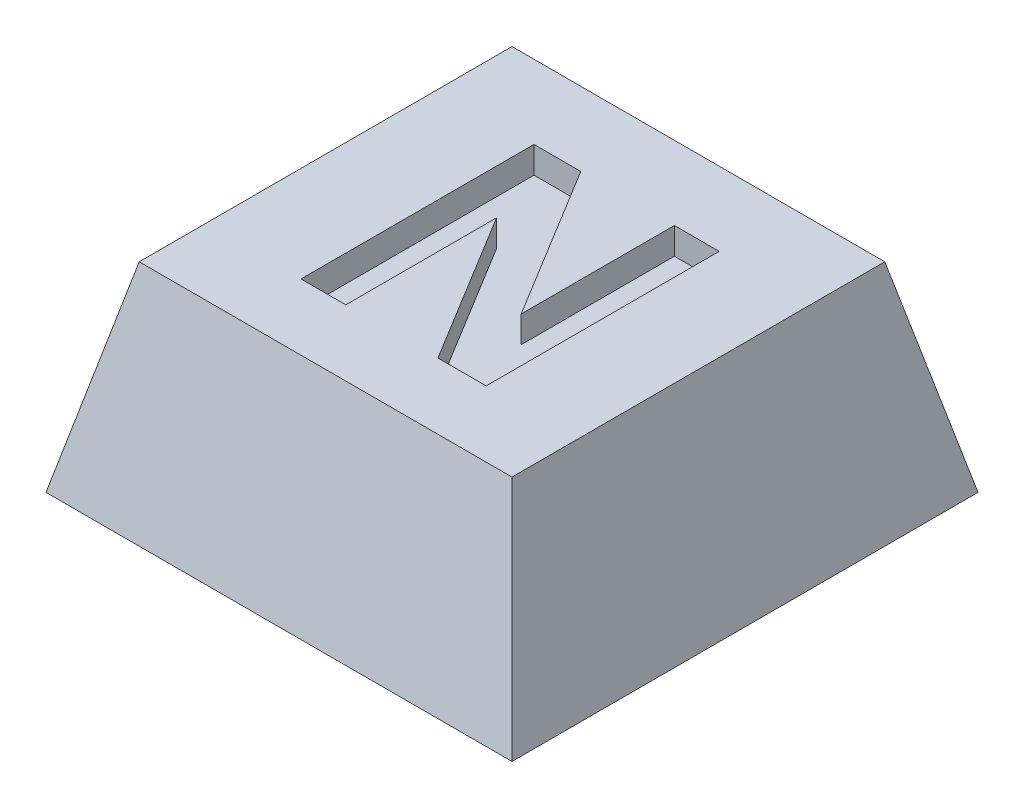
ISO-10303-21;
HEADER;
FILE_DESCRIPTION(('STEP AP214'),'2;1');
FILE_NAME('part.step','',(''),(''),'','','');
FILE_SCHEMA(('AUTOMOTIVE_DESIGN { 1 0 10303 214 1 1 1 1 }'));
ENDSEC;
DATA;
#1=APPLICATION_CONTEXT('core data for automotive mechanical design processes');
#2=APPLICATION_PROTOCOL_DEFINITION('international standard','automotive_design',2000,#1);
#3=PRODUCT_CONTEXT('',#1,'mechanical');
#4=PRODUCT('Part','Part','',(#3));
#5=PRODUCT_RELATED_PRODUCT_CATEGORY('part','',(#4));
#6=PRODUCT_DEFINITION_FORMATION('','',#4);
#7=PRODUCT_DEFINITION_CONTEXT('part definition',#1,'design');
#8=PRODUCT_DEFINITION('design','',#6,#7);
#9=PRODUCT_DEFINITION_SHAPE('','',#8);
#10=(LENGTH_UNIT() NAMED_UNIT(*) SI_UNIT(.MILLI.,.METRE.));
#11=(NAMED_UNIT(*) PLANE_ANGLE_UNIT() SI_UNIT($,.RADIAN.));
#12=(NAMED_UNIT(*) SI_UNIT($,.STERADIAN.) SOLID_ANGLE_UNIT());
#13=UNCERTAINTY_MEASURE_WITH_UNIT(LENGTH_MEASURE(1.E-05),#10,'distance_accuracy_value','');
#14=(GEOMETRIC_REPRESENTATION_CONTEXT(3) GLOBAL_UNCERTAINTY_ASSIGNED_CONTEXT((#13)) GLOBAL_UNIT_ASSIGNED_CONTEXT((#10,
#11,#12)) REPRESENTATION_CONTEXT('',''));
#15=CARTESIAN_POINT('',(0.,0.,0.));
#16=DIRECTION('',(0.,0.,1.));
#17=DIRECTION('',(1.,0.,0.));
#18=AXIS2_PLACEMENT_3D('',#15,#16,#17);
#19=CARTESIAN_POINT('',(0.,3.,0.));
#20=DIRECTION('',(0.,-1.,0.));
#21=DIRECTION('',(0.,0.,-1.));
#22=AXIS2_PLACEMENT_3D('',#19,#20,#21);
#23=PLANE('',#22);
#24=DIRECTION('',(-1.,0.,0.));
#25=VECTOR('',#24,1.);
#26=CARTESIAN_POINT('',(11.,3.,-0.7));
#27=LINE('',#26,#25);
#28=CARTESIAN_POINT('',(6.3,3.,-0.7));
#29=VERTEX_POINT('',#28);
#30=CARTESIAN_POINT('',(0.7,3.,-0.7));
#31=VERTEX_POINT('',#30);
#32=EDGE_CURVE('E65',#29,#31,#27,.T.);
#33=ORIENTED_EDGE('',*,*,#32,.F.);
#34=DIRECTION('',(0.,0.,1.));
#35=VECTOR('',#34,1.);
#36=CARTESIAN_POINT('',(6.3,3.,-7.));
#37=LINE('',#36,#35);
#38=CARTESIAN_POINT('',(6.3,3.,-6.3));
#39=VERTEX_POINT('',#38);
#40=EDGE_CURVE('E194',#39,#29,#37,.T.);
#41=ORIENTED_EDGE('',*,*,#40,.F.);
#42=DIRECTION('',(-1.,0.,0.));
#43=VECTOR('',#42,1.);
#44=CARTESIAN_POINT('',(11.,3.,-6.3));
#45=LINE('',#44,#43);
#46=CARTESIAN_POINT('',(0.699999999999998,3.,-6.3));
#47=VERTEX_POINT('',#46);
#48=EDGE_CURVE('E181',#39,#47,#45,.T.);
#49=ORIENTED_EDGE('',*,*,#48,.T.);
#50=DIRECTION('',(0.,0.,1.));
#51=VECTOR('',#50,1.);
#52=CARTESIAN_POINT('',(0.7,3.,-7.));
#53=LINE('',#52,#51);
#54=EDGE_CURVE('E195',#47,#31,#53,.T.);
#55=ORIENTED_EDGE('',*,*,#54,.T.);
#56=EDGE_LOOP('',(#33,#41,#49,#55));
#57=FACE_BOUND('',#56,.T.);
#58=DIRECTION('',(-1.,0.,0.));
#59=VECTOR('',#58,1.);
#60=CARTESIAN_POINT('',(2.81157453649931,3.,-1.69181267526304));
#61=LINE('',#60,#59);
#62=CARTESIAN_POINT('',(2.81157453649931,3.,-1.69181267526304));
#63=VERTEX_POINT('',#62);
#64=CARTESIAN_POINT('',(2.13849761342239,3.,-1.69181267526304));
#65=VERTEX_POINT('',#64);
#66=EDGE_CURVE('E58',#63,#65,#61,.T.);
#67=ORIENTED_EDGE('',*,*,#66,.T.);
#68=DIRECTION('',(0.,0.,-1.));
#69=VECTOR('',#68,1.);
#70=CARTESIAN_POINT('',(2.13849761342239,3.,-1.69181267526304));
#71=LINE('',#70,#69);
#72=CARTESIAN_POINT('',(2.13849761342239,3.,-5.19181267526304));
#73=VERTEX_POINT('',#72);
#74=EDGE_CURVE('E165',#65,#73,#71,.T.);
#75=ORIENTED_EDGE('',*,*,#74,.T.);
#76=DIRECTION('',(1.,0.,0.));
#77=VECTOR('',#76,1.);
#78=CARTESIAN_POINT('',(2.13849761342239,3.,-5.19181267526304));
#79=LINE('',#78,#77);
#80=CARTESIAN_POINT('',(2.8417227736788,3.,-5.19181267526304));
#81=VERTEX_POINT('',#80);
#82=EDGE_CURVE('E490',#73,#81,#79,.T.);
#83=ORIENTED_EDGE('',*,*,#82,.T.);
#84=DIRECTION('',(0.521323795742145,0.,0.853358951434273));
#85=VECTOR('',#84,1.);
#86=CARTESIAN_POINT('',(2.8417227736788,3.,-5.19181267526304));
#87=LINE('',#86,#85);
#88=CARTESIAN_POINT('',(4.24747197239675,3.,-2.89073094449381));
#89=VERTEX_POINT('',#88);
#90=EDGE_CURVE('E492',#81,#89,#87,.T.);
#91=ORIENTED_EDGE('',*,*,#90,.T.);
#92=DIRECTION('',(0.,0.,-1.));
#93=VECTOR('',#92,1.);
#94=CARTESIAN_POINT('',(4.24747197239675,3.,-2.89073094449381));
#95=LINE('',#94,#93);
#96=CARTESIAN_POINT('',(4.24747197239675,3.,-5.19181267526304));
#97=VERTEX_POINT('',#96);
#98=EDGE_CURVE('E497',#89,#97,#95,.T.);
#99=ORIENTED_EDGE('',*,*,#98,.T.);
#100=DIRECTION('',(1.,0.,0.));
#101=VECTOR('',#100,1.);
#102=CARTESIAN_POINT('',(4.24747197239675,3.,-5.19181267526304));
#103=LINE('',#102,#101);
#104=CARTESIAN_POINT('',(4.92054889547367,3.,-5.19181267526304));
#105=VERTEX_POINT('',#104);
#106=EDGE_CURVE('E507',#97,#105,#103,.T.);
#107=ORIENTED_EDGE('',*,*,#106,.T.);
#108=DIRECTION('',(0.,0.,1.));
#109=VECTOR('',#108,1.);
#110=CARTESIAN_POINT('',(4.92054889547367,3.,-5.19181267526304));
#111=LINE('',#110,#109);
#112=CARTESIAN_POINT('',(4.92054889547367,3.,-1.69181267526304));
#113=VERTEX_POINT('',#112);
#114=EDGE_CURVE('E462',#105,#113,#111,.T.);
#115=ORIENTED_EDGE('',*,*,#114,.T.);
#116=DIRECTION('',(-1.,0.,0.));
#117=VECTOR('',#116,1.);
#118=CARTESIAN_POINT('',(4.92054889547367,3.,-1.69181267526304));
#119=LINE('',#118,#117);
#120=CARTESIAN_POINT('',(4.19558895957624,3.,-1.69181267526304));
#121=VERTEX_POINT('',#120);
#122=EDGE_CURVE('E457',#113,#121,#119,.T.);
#123=ORIENTED_EDGE('',*,*,#122,.T.);
#124=DIRECTION('',(-0.521471380338423,0.,-0.853268773299445));
#125=VECTOR('',#124,1.);
#126=CARTESIAN_POINT('',(4.19558895957624,3.,-1.69181267526304));
#127=LINE('',#126,#125);
#128=CARTESIAN_POINT('',(2.81157453649931,3.,-3.95643607269893));
#129=VERTEX_POINT('',#128);
#130=EDGE_CURVE('E451',#121,#129,#127,.T.);
#131=ORIENTED_EDGE('',*,*,#130,.T.);
#132=DIRECTION('',(0.,0.,1.));
#133=VECTOR('',#132,1.);
#134=CARTESIAN_POINT('',(2.81157453649931,3.,-3.95643607269893));
#135=LINE('',#134,#133);
#136=EDGE_CURVE('E161',#129,#63,#135,.T.);
#137=ORIENTED_EDGE('',*,*,#136,.T.);
#138=EDGE_LOOP('',(#67,#75,#83,#91,#99,#107,#115,#123,#131,#137));
#139=FACE_BOUND('',#138,.T.);
#140=ADVANCED_FACE('F42',(#57,#139),#23,.F.);
#141=CARTESIAN_POINT('',(7.,0.,-7.));
#142=DIRECTION('',(-0.973841209741793,-0.227229615606418,0.));
#143=DIRECTION('',(0.227229615606418,-0.973841209741793,0.));
#144=AXIS2_PLACEMENT_3D('',#141,#142,#143);
#145=PLANE('',#144);
#146=DIRECTION('',(-0.221581128241521,0.949633406749377,-0.221581128241521));
#147=VECTOR('',#146,1.);
#148=CARTESIAN_POINT('',(6.6563126252505,1.47294589178357,-0.343687374749499));
#149=LINE('',#148,#147);
#150=CARTESIAN_POINT('',(7.,0.,0.));
#151=VERTEX_POINT('',#150);
#152=EDGE_CURVE('E191',#151,#29,#149,.T.);
#153=ORIENTED_EDGE('',*,*,#152,.F.);
#154=DIRECTION('',(0.,0.,-1.));
#155=VECTOR('',#154,1.);
#156=CARTESIAN_POINT('',(7.,0.,0.));
#157=LINE('',#156,#155);
#158=CARTESIAN_POINT('',(7.,0.,-7.));
#159=VERTEX_POINT('',#158);
#160=EDGE_CURVE('E209',#151,#159,#157,.T.);
#161=ORIENTED_EDGE('',*,*,#160,.T.);
#162=DIRECTION('',(0.221581128241521,-0.949633406749377,-0.221581128241521));
#163=VECTOR('',#162,1.);
#164=CARTESIAN_POINT('',(7.,0.,-7.));
#165=LINE('',#164,#163);
#166=EDGE_CURVE('E185',#39,#159,#165,.T.);
#167=ORIENTED_EDGE('',*,*,#166,.F.);
#168=ORIENTED_EDGE('',*,*,#40,.T.);
#169=EDGE_LOOP('',(#153,#161,#167,#168));
#170=FACE_BOUND('',#169,.T.);
#171=ADVANCED_FACE('F234',(#170),#145,.F.);
#172=CARTESIAN_POINT('',(0.,0.,-7.));
#173=DIRECTION('',(0.973841209741793,-0.227229615606418,0.));
#174=DIRECTION('',(0.227229615606418,0.973841209741793,0.));
#175=AXIS2_PLACEMENT_3D('',#172,#173,#174);
#176=PLANE('',#175);
#177=DIRECTION('',(-0.221581128241521,-0.949633406749378,0.221581128241521));
#178=VECTOR('',#177,1.);
#179=CARTESIAN_POINT('',(0.343687374749499,1.47294589178357,-0.3436873747495));
#180=LINE('',#179,#178);
#181=CARTESIAN_POINT('',(0.,0.,0.));
#182=VERTEX_POINT('',#181);
#183=EDGE_CURVE('E11',#31,#182,#180,.T.);
#184=ORIENTED_EDGE('',*,*,#183,.F.);
#185=ORIENTED_EDGE('',*,*,#54,.F.);
#186=DIRECTION('',(0.221581128241521,0.949633406749377,0.221581128241521));
#187=VECTOR('',#186,1.);
#188=CARTESIAN_POINT('',(0.,0.,-7.));
#189=LINE('',#188,#187);
#190=CARTESIAN_POINT('',(0.,0.,-7.));
#191=VERTEX_POINT('',#190);
#192=EDGE_CURVE('E51',#191,#47,#189,.T.);
#193=ORIENTED_EDGE('',*,*,#192,.F.);
#194=DIRECTION('',(0.,0.,1.));
#195=VECTOR('',#194,1.);
#196=CARTESIAN_POINT('',(0.,0.,0.));
#197=LINE('',#196,#195);
#198=EDGE_CURVE('E199',#191,#182,#197,.T.);
#199=ORIENTED_EDGE('',*,*,#198,.T.);
#200=EDGE_LOOP('',(#184,#185,#193,#199));
#201=FACE_BOUND('',#200,.T.);
#202=ADVANCED_FACE('F227',(#201),#176,.F.);
#203=CARTESIAN_POINT('',(0.,0.,0.));
#204=DIRECTION('',(0.,-1.,0.));
#205=DIRECTION('',(0.,0.,-1.));
#206=AXIS2_PLACEMENT_3D('',#203,#204,#205);
#207=PLANE('',#206);
#208=CARTESIAN_POINT('',(3.5,0.,-3.5));
#209=DIRECTION('',(0.,-1.,0.));
#210=DIRECTION('',(0.,0.,-1.));
#211=AXIS2_PLACEMENT_3D('',#208,#209,#210);
#212=CIRCLE('',#211,1.8);
#213=CARTESIAN_POINT('',(3.5,0.,-5.3));
#214=VERTEX_POINT('',#213);
#215=EDGE_CURVE('E167',#214,#214,#212,.T.);
#216=ORIENTED_EDGE('',*,*,#215,.F.);
#217=EDGE_LOOP('',(#216));
#218=FACE_BOUND('',#217,.T.);
#219=ORIENTED_EDGE('',*,*,#198,.F.);
#220=DIRECTION('',(-1.,0.,0.));
#221=VECTOR('',#220,1.);
#222=CARTESIAN_POINT('',(0.,0.,-7.));
#223=LINE('',#222,#221);
#224=EDGE_CURVE('E213',#159,#191,#223,.T.);
#225=ORIENTED_EDGE('',*,*,#224,.F.);
#226=ORIENTED_EDGE('',*,*,#160,.F.);
#227=DIRECTION('',(1.,0.,0.));
#228=VECTOR('',#227,1.);
#229=CARTESIAN_POINT('',(0.,0.,0.));
#230=LINE('',#229,#228);
#231=EDGE_CURVE('E206',#182,#151,#230,.T.);
#232=ORIENTED_EDGE('',*,*,#231,.F.);
#233=EDGE_LOOP('',(#219,#225,#226,#232));
#234=FACE_BOUND('',#233,.T.);
#235=ADVANCED_FACE('F44',(#218,#234),#207,.T.);
#236=CARTESIAN_POINT('',(11.,3.,-6.3));
#237=DIRECTION('',(0.,0.227229615606418,-0.973841209741793));
#238=DIRECTION('',(0.,0.973841209741793,0.227229615606418));
#239=AXIS2_PLACEMENT_3D('',#236,#237,#238);
#240=PLANE('',#239);
#241=ORIENTED_EDGE('',*,*,#166,.T.);
#242=ORIENTED_EDGE('',*,*,#224,.T.);
#243=ORIENTED_EDGE('',*,*,#192,.T.);
#244=ORIENTED_EDGE('',*,*,#48,.F.);
#245=EDGE_LOOP('',(#241,#242,#243,#244));
#246=FACE_BOUND('',#245,.T.);
#247=ADVANCED_FACE('F218',(#246),#240,.T.);
#248=CARTESIAN_POINT('',(11.,0.,0.));
#249=DIRECTION('',(0.,0.227229615606418,0.973841209741793));
#250=DIRECTION('',(0.,-0.973841209741793,0.227229615606418));
#251=AXIS2_PLACEMENT_3D('',#248,#249,#250);
#252=PLANE('',#251);
#253=ORIENTED_EDGE('',*,*,#152,.T.);
#254=ORIENTED_EDGE('',*,*,#32,.T.);
#255=ORIENTED_EDGE('',*,*,#183,.T.);
#256=ORIENTED_EDGE('',*,*,#231,.T.);
#257=EDGE_LOOP('',(#253,#254,#255,#256));
#258=FACE_BOUND('',#257,.T.);
#259=ADVANCED_FACE('F229',(#258),#252,.T.);
#260=CARTESIAN_POINT('',(3.5,0.8,-3.5));
#261=DIRECTION('',(0.,-1.,0.));
#262=DIRECTION('',(0.,0.,-1.));
#263=AXIS2_PLACEMENT_3D('',#260,#261,#262);
#264=CYLINDRICAL_SURFACE('',#263,1.8);
#265=CARTESIAN_POINT('',(3.5,0.8,-3.5));
#266=DIRECTION('',(0.,-1.,0.));
#267=DIRECTION('',(0.,0.,-1.));
#268=AXIS2_PLACEMENT_3D('',#265,#266,#267);
#269=CIRCLE('',#268,1.8);
#270=CARTESIAN_POINT('',(3.5,0.8,-5.3));
#271=VERTEX_POINT('',#270);
#272=EDGE_CURVE('E173',#271,#271,#269,.T.);
#273=ORIENTED_EDGE('',*,*,#272,.F.);
#274=EDGE_LOOP('',(#273));
#275=FACE_BOUND('',#274,.T.);
#276=ORIENTED_EDGE('',*,*,#215,.T.);
#277=EDGE_LOOP('',(#276));
#278=FACE_BOUND('',#277,.T.);
#279=ADVANCED_FACE('F254',(#275,#278),#264,.F.);
#280=CARTESIAN_POINT('',(3.5,0.8,-3.5));
#281=DIRECTION('',(0.,-1.,0.));
#282=DIRECTION('',(0.,0.,-1.));
#283=AXIS2_PLACEMENT_3D('',#280,#281,#282);
#284=PLANE('',#283);
#285=ORIENTED_EDGE('',*,*,#272,.T.);
#286=EDGE_LOOP('',(#285));
#287=FACE_BOUND('',#286,.T.);
#288=ADVANCED_FACE('F257',(#287),#284,.T.);
#289=CARTESIAN_POINT('',(2.81157453649931,2.6,-1.69181267526304));
#290=DIRECTION('',(0.,0.,-1.));
#291=DIRECTION('',(-1.,0.,0.));
#292=AXIS2_PLACEMENT_3D('',#289,#290,#291);
#293=PLANE('',#292);
#294=ORIENTED_EDGE('',*,*,#66,.F.);
#295=DIRECTION('',(0.,1.,0.));
#296=VECTOR('',#295,1.);
#297=CARTESIAN_POINT('',(2.81157453649931,2.6,-1.69181267526304));
#298=LINE('',#297,#296);
#299=CARTESIAN_POINT('',(2.81157453649931,2.6,-1.69181267526304));
#300=VERTEX_POINT('',#299);
#301=EDGE_CURVE('E159',#300,#63,#298,.T.);
#302=ORIENTED_EDGE('',*,*,#301,.F.);
#303=DIRECTION('',(-1.,0.,0.));
#304=VECTOR('',#303,1.);
#305=CARTESIAN_POINT('',(2.81157453649931,2.6,-1.69181267526304));
#306=LINE('',#305,#304);
#307=CARTESIAN_POINT('',(2.13849761342239,2.6,-1.69181267526304));
#308=VERTEX_POINT('',#307);
#309=EDGE_CURVE('E149',#300,#308,#306,.T.);
#310=ORIENTED_EDGE('',*,*,#309,.T.);
#311=DIRECTION('',(0.,1.,0.));
#312=VECTOR('',#311,1.);
#313=CARTESIAN_POINT('',(2.13849761342239,2.6,-1.69181267526304));
#314=LINE('',#313,#312);
#315=EDGE_CURVE('E158',#308,#65,#314,.T.);
#316=ORIENTED_EDGE('',*,*,#315,.T.);
#317=EDGE_LOOP('',(#294,#302,#310,#316));
#318=FACE_BOUND('',#317,.T.);
#319=ADVANCED_FACE('F157',(#318),#293,.T.);
#320=CARTESIAN_POINT('',(2.13849761342239,2.6,-1.69181267526304));
#321=DIRECTION('',(1.,0.,0.));
#322=DIRECTION('',(0.,0.,-1.));
#323=AXIS2_PLACEMENT_3D('',#320,#321,#322);
#324=PLANE('',#323);
#325=ORIENTED_EDGE('',*,*,#74,.F.);
#326=ORIENTED_EDGE('',*,*,#315,.F.);
#327=DIRECTION('',(0.,0.,-1.));
#328=VECTOR('',#327,1.);
#329=CARTESIAN_POINT('',(2.13849761342239,2.6,-1.69181267526304));
#330=LINE('',#329,#328);
#331=CARTESIAN_POINT('',(2.13849761342239,2.6,-5.19181267526304));
#332=VERTEX_POINT('',#331);
#333=EDGE_CURVE('E145',#308,#332,#330,.T.);
#334=ORIENTED_EDGE('',*,*,#333,.T.);
#335=DIRECTION('',(0.,1.,0.));
#336=VECTOR('',#335,1.);
#337=CARTESIAN_POINT('',(2.13849761342239,2.6,-5.19181267526304));
#338=LINE('',#337,#336);
#339=EDGE_CURVE('E168',#332,#73,#338,.T.);
#340=ORIENTED_EDGE('',*,*,#339,.T.);
#341=EDGE_LOOP('',(#325,#326,#334,#340));
#342=FACE_BOUND('',#341,.T.);
#343=ADVANCED_FACE('F163',(#342),#324,.T.);
#344=CARTESIAN_POINT('',(2.13849761342239,2.6,-5.19181267526304));
#345=DIRECTION('',(0.,0.,1.));
#346=DIRECTION('',(1.,0.,0.));
#347=AXIS2_PLACEMENT_3D('',#344,#345,#346);
#348=PLANE('',#347);
#349=ORIENTED_EDGE('',*,*,#82,.F.);
#350=ORIENTED_EDGE('',*,*,#339,.F.);
#351=DIRECTION('',(1.,0.,0.));
#352=VECTOR('',#351,1.);
#353=CARTESIAN_POINT('',(2.13849761342239,2.6,-5.19181267526304));
#354=LINE('',#353,#352);
#355=CARTESIAN_POINT('',(2.8417227736788,2.6,-5.19181267526304));
#356=VERTEX_POINT('',#355);
#357=EDGE_CURVE('E151',#332,#356,#354,.T.);
#358=ORIENTED_EDGE('',*,*,#357,.T.);
#359=DIRECTION('',(0.,1.,0.));
#360=VECTOR('',#359,1.);
#361=CARTESIAN_POINT('',(2.8417227736788,2.6,-5.19181267526304));
#362=LINE('',#361,#360);
#363=EDGE_CURVE('E175',#356,#81,#362,.T.);
#364=ORIENTED_EDGE('',*,*,#363,.T.);
#365=EDGE_LOOP('',(#349,#350,#358,#364));
#366=FACE_BOUND('',#365,.T.);
#367=ADVANCED_FACE('F266',(#366),#348,.T.);
#368=CARTESIAN_POINT('',(2.8417227736788,2.6,-5.19181267526304));
#369=DIRECTION('',(-0.853358951434273,0.,0.521323795742145));
#370=DIRECTION('',(0.521323795742145,0.,0.853358951434273));
#371=AXIS2_PLACEMENT_3D('',#368,#369,#370);
#372=PLANE('',#371);
#373=ORIENTED_EDGE('',*,*,#90,.F.);
#374=ORIENTED_EDGE('',*,*,#363,.F.);
#375=DIRECTION('',(0.521323795742145,0.,0.853358951434273));
#376=VECTOR('',#375,1.);
#377=CARTESIAN_POINT('',(2.8417227736788,2.6,-5.19181267526304));
#378=LINE('',#377,#376);
#379=CARTESIAN_POINT('',(4.24747197239675,2.6,-2.89073094449381));
#380=VERTEX_POINT('',#379);
#381=EDGE_CURVE('E537',#356,#380,#378,.T.);
#382=ORIENTED_EDGE('',*,*,#381,.T.);
#383=DIRECTION('',(0.,1.,0.));
#384=VECTOR('',#383,1.);
#385=CARTESIAN_POINT('',(4.24747197239675,2.6,-2.89073094449381));
#386=LINE('',#385,#384);
#387=EDGE_CURVE('E483',#380,#89,#386,.T.);
#388=ORIENTED_EDGE('',*,*,#387,.T.);
#389=EDGE_LOOP('',(#373,#374,#382,#388));
#390=FACE_BOUND('',#389,.T.);
#391=ADVANCED_FACE('F269',(#390),#372,.T.);
#392=CARTESIAN_POINT('',(4.24747197239675,2.6,-2.89073094449381));
#393=DIRECTION('',(1.,0.,0.));
#394=DIRECTION('',(0.,0.,-1.));
#395=AXIS2_PLACEMENT_3D('',#392,#393,#394);
#396=PLANE('',#395);
#397=ORIENTED_EDGE('',*,*,#98,.F.);
#398=ORIENTED_EDGE('',*,*,#387,.F.);
#399=DIRECTION('',(0.,0.,-1.));
#400=VECTOR('',#399,1.);
#401=CARTESIAN_POINT('',(4.24747197239675,2.6,-2.89073094449381));
#402=LINE('',#401,#400);
#403=CARTESIAN_POINT('',(4.24747197239675,2.6,-5.19181267526304));
#404=VERTEX_POINT('',#403);
#405=EDGE_CURVE('E534',#380,#404,#402,.T.);
#406=ORIENTED_EDGE('',*,*,#405,.T.);
#407=DIRECTION('',(0.,1.,0.));
#408=VECTOR('',#407,1.);
#409=CARTESIAN_POINT('',(4.24747197239675,2.6,-5.19181267526304));
#410=LINE('',#409,#408);
#411=EDGE_CURVE('E480',#404,#97,#410,.T.);
#412=ORIENTED_EDGE('',*,*,#411,.T.);
#413=EDGE_LOOP('',(#397,#398,#406,#412));
#414=FACE_BOUND('',#413,.T.);
#415=ADVANCED_FACE('F273',(#414),#396,.T.);
#416=CARTESIAN_POINT('',(4.24747197239675,2.6,-5.19181267526304));
#417=DIRECTION('',(0.,0.,1.));
#418=DIRECTION('',(1.,0.,0.));
#419=AXIS2_PLACEMENT_3D('',#416,#417,#418);
#420=PLANE('',#419);
#421=ORIENTED_EDGE('',*,*,#106,.F.);
#422=ORIENTED_EDGE('',*,*,#411,.F.);
#423=DIRECTION('',(1.,0.,0.));
#424=VECTOR('',#423,1.);
#425=CARTESIAN_POINT('',(4.24747197239675,2.6,-5.19181267526304));
#426=LINE('',#425,#424);
#427=CARTESIAN_POINT('',(4.92054889547367,2.6,-5.19181267526304));
#428=VERTEX_POINT('',#427);
#429=EDGE_CURVE('E531',#404,#428,#426,.T.);
#430=ORIENTED_EDGE('',*,*,#429,.T.);
#431=DIRECTION('',(0.,1.,0.));
#432=VECTOR('',#431,1.);
#433=CARTESIAN_POINT('',(4.92054889547367,2.6,-5.19181267526304));
#434=LINE('',#433,#432);
#435=EDGE_CURVE('E477',#428,#105,#434,.T.);
#436=ORIENTED_EDGE('',*,*,#435,.T.);
#437=EDGE_LOOP('',(#421,#422,#430,#436));
#438=FACE_BOUND('',#437,.T.);
#439=ADVANCED_FACE('F277',(#438),#420,.T.);
#440=CARTESIAN_POINT('',(4.92054889547367,2.6,-5.19181267526304));
#441=DIRECTION('',(-1.,0.,0.));
#442=DIRECTION('',(0.,0.,1.));
#443=AXIS2_PLACEMENT_3D('',#440,#441,#442);
#444=PLANE('',#443);
#445=ORIENTED_EDGE('',*,*,#114,.F.);
#446=ORIENTED_EDGE('',*,*,#435,.F.);
#447=DIRECTION('',(0.,0.,1.));
#448=VECTOR('',#447,1.);
#449=CARTESIAN_POINT('',(4.92054889547367,2.6,-5.19181267526304));
#450=LINE('',#449,#448);
#451=CARTESIAN_POINT('',(4.92054889547367,2.6,-1.69181267526304));
#452=VERTEX_POINT('',#451);
#453=EDGE_CURVE('E516',#428,#452,#450,.T.);
#454=ORIENTED_EDGE('',*,*,#453,.T.);
#455=DIRECTION('',(0.,1.,0.));
#456=VECTOR('',#455,1.);
#457=CARTESIAN_POINT('',(4.92054889547367,2.6,-1.69181267526304));
#458=LINE('',#457,#456);
#459=EDGE_CURVE('E474',#452,#113,#458,.T.);
#460=ORIENTED_EDGE('',*,*,#459,.T.);
#461=EDGE_LOOP('',(#445,#446,#454,#460));
#462=FACE_BOUND('',#461,.T.);
#463=ADVANCED_FACE('F281',(#462),#444,.T.);
#464=CARTESIAN_POINT('',(4.92054889547367,2.6,-1.69181267526304));
#465=DIRECTION('',(0.,0.,-1.));
#466=DIRECTION('',(-1.,0.,0.));
#467=AXIS2_PLACEMENT_3D('',#464,#465,#466);
#468=PLANE('',#467);
#469=ORIENTED_EDGE('',*,*,#122,.F.);
#470=ORIENTED_EDGE('',*,*,#459,.F.);
#471=DIRECTION('',(-1.,0.,0.));
#472=VECTOR('',#471,1.);
#473=CARTESIAN_POINT('',(4.92054889547367,2.6,-1.69181267526304));
#474=LINE('',#473,#472);
#475=CARTESIAN_POINT('',(4.19558895957624,2.6,-1.69181267526304));
#476=VERTEX_POINT('',#475);
#477=EDGE_CURVE('E518',#452,#476,#474,.T.);
#478=ORIENTED_EDGE('',*,*,#477,.T.);
#479=DIRECTION('',(0.,1.,0.));
#480=VECTOR('',#479,1.);
#481=CARTESIAN_POINT('',(4.19558895957624,2.6,-1.69181267526304));
#482=LINE('',#481,#480);
#483=EDGE_CURVE('E471',#476,#121,#482,.T.);
#484=ORIENTED_EDGE('',*,*,#483,.T.);
#485=EDGE_LOOP('',(#469,#470,#478,#484));
#486=FACE_BOUND('',#485,.T.);
#487=ADVANCED_FACE('F285',(#486),#468,.T.);
#488=CARTESIAN_POINT('',(4.19558895957624,2.6,-1.69181267526304));
#489=DIRECTION('',(0.853268773299445,0.,-0.521471380338423));
#490=DIRECTION('',(-0.521471380338423,0.,-0.853268773299445));
#491=AXIS2_PLACEMENT_3D('',#488,#489,#490);
#492=PLANE('',#491);
#493=ORIENTED_EDGE('',*,*,#130,.F.);
#494=ORIENTED_EDGE('',*,*,#483,.F.);
#495=DIRECTION('',(-0.521471380338423,0.,-0.853268773299445));
#496=VECTOR('',#495,1.);
#497=CARTESIAN_POINT('',(4.19558895957624,2.6,-1.69181267526304));
#498=LINE('',#497,#496);
#499=CARTESIAN_POINT('',(2.81157453649931,2.6,-3.95643607269893));
#500=VERTEX_POINT('',#499);
#501=EDGE_CURVE('E520',#476,#500,#498,.T.);
#502=ORIENTED_EDGE('',*,*,#501,.T.);
#503=DIRECTION('',(0.,1.,0.));
#504=VECTOR('',#503,1.);
#505=CARTESIAN_POINT('',(2.81157453649931,2.6,-3.95643607269893));
#506=LINE('',#505,#504);
#507=EDGE_CURVE('E449',#500,#129,#506,.T.);
#508=ORIENTED_EDGE('',*,*,#507,.T.);
#509=EDGE_LOOP('',(#493,#494,#502,#508));
#510=FACE_BOUND('',#509,.T.);
#511=ADVANCED_FACE('F289',(#510),#492,.T.);
#512=CARTESIAN_POINT('',(2.81157453649931,2.6,-3.95643607269893));
#513=DIRECTION('',(-1.,0.,0.));
#514=DIRECTION('',(0.,0.,1.));
#515=AXIS2_PLACEMENT_3D('',#512,#513,#514);
#516=PLANE('',#515);
#517=ORIENTED_EDGE('',*,*,#136,.F.);
#518=ORIENTED_EDGE('',*,*,#507,.F.);
#519=DIRECTION('',(0.,0.,1.));
#520=VECTOR('',#519,1.);
#521=CARTESIAN_POINT('',(2.81157453649931,2.6,-3.95643607269893));
#522=LINE('',#521,#520);
#523=EDGE_CURVE('E468',#500,#300,#522,.T.);
#524=ORIENTED_EDGE('',*,*,#523,.T.);
#525=ORIENTED_EDGE('',*,*,#301,.T.);
#526=EDGE_LOOP('',(#517,#518,#524,#525));
#527=FACE_BOUND('',#526,.T.);
#528=ADVANCED_FACE('F293',(#527),#516,.T.);
#529=CARTESIAN_POINT('',(0.,2.6,0.));
#530=DIRECTION('',(0.,-1.,0.));
#531=DIRECTION('',(0.,0.,-1.));
#532=AXIS2_PLACEMENT_3D('',#529,#530,#531);
#533=PLANE('',#532);
#534=ORIENTED_EDGE('',*,*,#309,.F.);
#535=ORIENTED_EDGE('',*,*,#523,.F.);
#536=ORIENTED_EDGE('',*,*,#501,.F.);
#537=ORIENTED_EDGE('',*,*,#477,.F.);
#538=ORIENTED_EDGE('',*,*,#453,.F.);
#539=ORIENTED_EDGE('',*,*,#429,.F.);
#540=ORIENTED_EDGE('',*,*,#405,.F.);
#541=ORIENTED_EDGE('',*,*,#381,.F.);
#542=ORIENTED_EDGE('',*,*,#357,.F.);
#543=ORIENTED_EDGE('',*,*,#333,.F.);
#544=EDGE_LOOP('',(#534,#535,#536,#537,#538,#539,#540,#541,#542,#543));
#545=FACE_BOUND('',#544,.T.);
#546=ADVANCED_FACE('F147',(#545),#533,.F.);
#547=CLOSED_SHELL('',(#140,#171,#202,#235,#247,#259,#279,#288,#319,#343,#367,#391,#415,#439,
#463,#487,#511,#528,#546));
#548=MANIFOLD_SOLID_BREP('B2',#547);
#549=ADVANCED_BREP_SHAPE_REPRESENTATION('',(#18,#548),#14);
#550=SHAPE_DEFINITION_REPRESENTATION(#9,#549);
ENDSEC;
END-ISO-10303-21;
